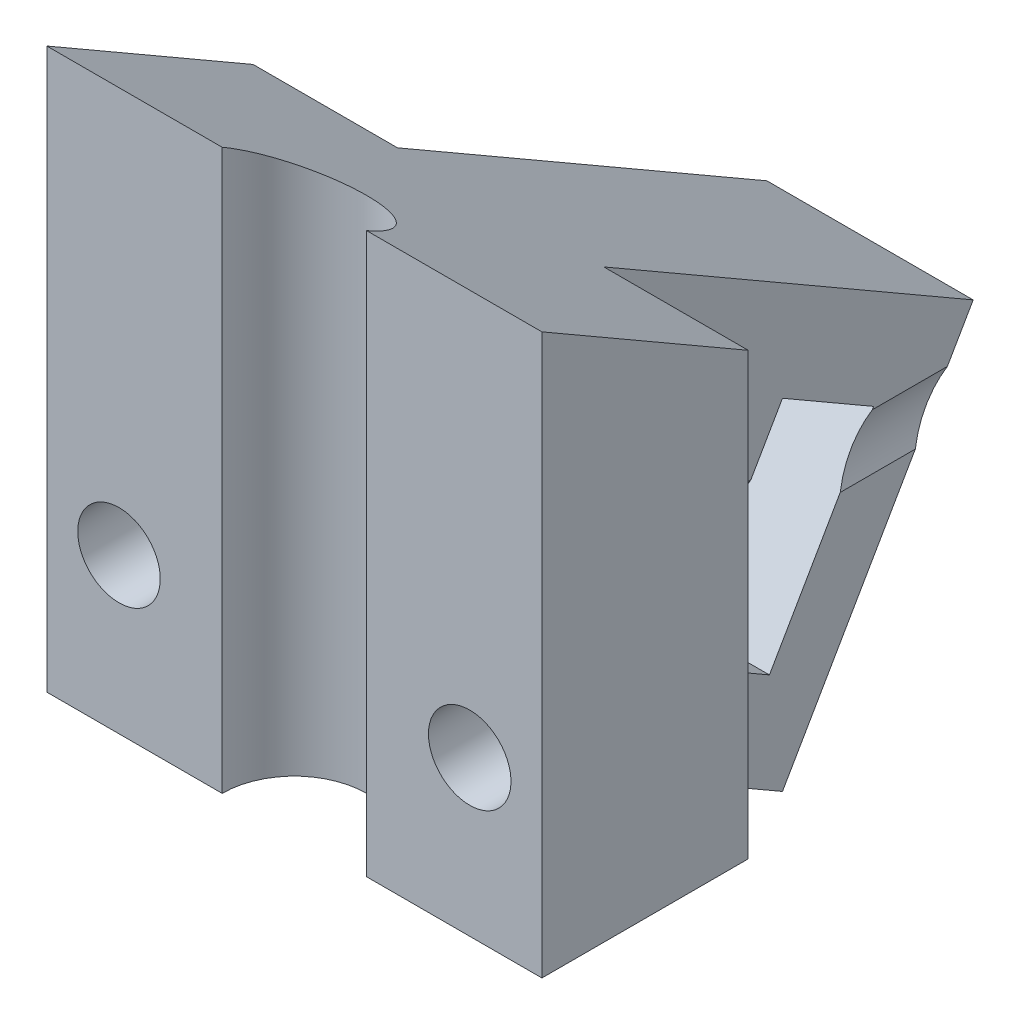
ISO-10303-21;
HEADER;
FILE_DESCRIPTION(('STEP AP214'),'2;1');
FILE_NAME('part.step','',(''),(''),'','','');
FILE_SCHEMA(('AUTOMOTIVE_DESIGN { 1 0 10303 214 1 1 1 1 }'));
ENDSEC;
DATA;
#1=APPLICATION_CONTEXT('core data for automotive mechanical design processes');
#2=APPLICATION_PROTOCOL_DEFINITION('international standard','automotive_design',2000,#1);
#3=PRODUCT_CONTEXT('',#1,'mechanical');
#4=PRODUCT('Part','Part','',(#3));
#5=PRODUCT_RELATED_PRODUCT_CATEGORY('part','',(#4));
#6=PRODUCT_DEFINITION_FORMATION('','',#4);
#7=PRODUCT_DEFINITION_CONTEXT('part definition',#1,'design');
#8=PRODUCT_DEFINITION('design','',#6,#7);
#9=PRODUCT_DEFINITION_SHAPE('','',#8);
#10=(LENGTH_UNIT() NAMED_UNIT(*) SI_UNIT(.MILLI.,.METRE.));
#11=(NAMED_UNIT(*) PLANE_ANGLE_UNIT() SI_UNIT($,.RADIAN.));
#12=(NAMED_UNIT(*) SI_UNIT($,.STERADIAN.) SOLID_ANGLE_UNIT());
#13=UNCERTAINTY_MEASURE_WITH_UNIT(LENGTH_MEASURE(1.E-05),#10,'distance_accuracy_value','');
#14=(GEOMETRIC_REPRESENTATION_CONTEXT(3) GLOBAL_UNCERTAINTY_ASSIGNED_CONTEXT((#13)) GLOBAL_UNIT_ASSIGNED_CONTEXT((#10,
#11,#12)) REPRESENTATION_CONTEXT('',''));
#15=CARTESIAN_POINT('',(0.,0.,0.));
#16=DIRECTION('',(0.,0.,1.));
#17=DIRECTION('',(1.,0.,0.));
#18=AXIS2_PLACEMENT_3D('',#15,#16,#17);
#19=CARTESIAN_POINT('',(-10.,0.,0.));
#20=DIRECTION('',(1.,0.,0.));
#21=DIRECTION('',(0.,0.,-1.));
#22=AXIS2_PLACEMENT_3D('',#19,#20,#21);
#23=PLANE('',#22);
#24=DIRECTION('',(0.,1.,0.));
#25=VECTOR('',#24,1.);
#26=CARTESIAN_POINT('',(-10.,0.,-10.));
#27=LINE('',#26,#25);
#28=CARTESIAN_POINT('',(-10.,17.6925824035673,-10.));
#29=VERTEX_POINT('',#28);
#30=CARTESIAN_POINT('',(-10.,42.7017059221719,-10.));
#31=VERTEX_POINT('',#30);
#32=EDGE_CURVE('E378',#29,#31,#27,.T.);
#33=ORIENTED_EDGE('',*,*,#32,.T.);
#34=DIRECTION('',(0.,-0.499999999999989,-0.866025403784445));
#35=VECTOR('',#34,1.);
#36=CARTESIAN_POINT('',(-10.,30.,-32.));
#37=LINE('',#36,#35);
#38=CARTESIAN_POINT('',(-10.,22.0262794416292,-45.810889132455));
#39=VERTEX_POINT('',#38);
#40=EDGE_CURVE('E382',#31,#39,#37,.T.);
#41=ORIENTED_EDGE('',*,*,#40,.T.);
#42=DIRECTION('',(0.,-0.866025403784445,0.499999999999989));
#43=VECTOR('',#42,1.);
#44=CARTESIAN_POINT('',(-10.,22.0262794416292,-45.810889132455));
#45=LINE('',#44,#43);
#46=CARTESIAN_POINT('',(-10.,17.6925824035673,-43.3088279809437));
#47=VERTEX_POINT('',#46);
#48=EDGE_CURVE('E385',#39,#47,#45,.T.);
#49=ORIENTED_EDGE('',*,*,#48,.T.);
#50=DIRECTION('',(0.,0.,1.));
#51=VECTOR('',#50,1.);
#52=CARTESIAN_POINT('',(-10.,17.6925824035673,-45.810889132455));
#53=LINE('',#52,#51);
#54=CARTESIAN_POINT('',(-10.,17.6925824035673,-36.0283340827204));
#55=VERTEX_POINT('',#54);
#56=EDGE_CURVE('E493',#55,#47,#53,.F.);
#57=ORIENTED_EDGE('',*,*,#56,.F.);
#58=DIRECTION('',(0.,-0.866025403784439,0.5));
#59=VECTOR('',#58,1.);
#60=CARTESIAN_POINT('',(-10.,0.418829476571087,-26.055328180404));
#61=LINE('',#60,#59);
#62=CARTESIAN_POINT('',(-10.,17.9125426330167,-36.155328180404));
#63=VERTEX_POINT('',#62);
#64=EDGE_CURVE('E348',#63,#55,#61,.T.);
#65=ORIENTED_EDGE('',*,*,#64,.F.);
#66=DIRECTION('',(0.,-0.5,-0.866025403784439));
#67=VECTOR('',#66,1.);
#68=CARTESIAN_POINT('',(-10.,23.0125426330167,-27.3218690618028));
#69=LINE('',#68,#67);
#70=CARTESIAN_POINT('',(-10.,23.0125426330167,-27.3218690618028));
#71=VERTEX_POINT('',#70);
#72=EDGE_CURVE('E344',#71,#63,#69,.T.);
#73=ORIENTED_EDGE('',*,*,#72,.F.);
#74=DIRECTION('',(0.,0.866025403784439,-0.5));
#75=VECTOR('',#74,1.);
#76=CARTESIAN_POINT('',(-10.,5.51882947657109,-17.2218690618028));
#77=LINE('',#76,#75);
#78=CARTESIAN_POINT('',(-10.,17.6925824035673,-24.250388591252));
#79=VERTEX_POINT('',#78);
#80=EDGE_CURVE('E340',#79,#71,#77,.T.);
#81=ORIENTED_EDGE('',*,*,#80,.F.);
#82=EDGE_CURVE('E61',#29,#79,#53,.F.);
#83=ORIENTED_EDGE('',*,*,#82,.F.);
#84=EDGE_LOOP('',(#33,#41,#49,#57,#65,#73,#81,#83));
#85=FACE_BOUND('',#84,.T.);
#86=ADVANCED_FACE('F37',(#85),#23,.F.);
#87=CARTESIAN_POINT('',(10.,0.,0.));
#88=DIRECTION('',(1.,0.,0.));
#89=DIRECTION('',(0.,0.,-1.));
#90=AXIS2_PLACEMENT_3D('',#87,#88,#89);
#91=PLANE('',#90);
#92=DIRECTION('',(0.,0.499999999999989,0.866025403784445));
#93=VECTOR('',#92,1.);
#94=CARTESIAN_POINT('',(10.,30.,-32.));
#95=LINE('',#94,#93);
#96=CARTESIAN_POINT('',(10.,22.0262794416292,-45.810889132455));
#97=VERTEX_POINT('',#96);
#98=CARTESIAN_POINT('',(10.,42.7017059221719,-10.));
#99=VERTEX_POINT('',#98);
#100=EDGE_CURVE('E228',#97,#99,#95,.T.);
#101=ORIENTED_EDGE('',*,*,#100,.T.);
#102=DIRECTION('',(0.,-1.,0.));
#103=VECTOR('',#102,1.);
#104=CARTESIAN_POINT('',(10.,0.,-10.));
#105=LINE('',#104,#103);
#106=CARTESIAN_POINT('',(10.,17.6925824035672,-10.));
#107=VERTEX_POINT('',#106);
#108=EDGE_CURVE('E233',#99,#107,#105,.T.);
#109=ORIENTED_EDGE('',*,*,#108,.T.);
#110=DIRECTION('',(0.,0.,1.));
#111=VECTOR('',#110,1.);
#112=CARTESIAN_POINT('',(10.,17.6925824035672,-45.810889132455));
#113=LINE('',#112,#111);
#114=CARTESIAN_POINT('',(10.,17.6925824035672,-24.250388591252));
#115=VERTEX_POINT('',#114);
#116=EDGE_CURVE('E413',#107,#115,#113,.F.);
#117=ORIENTED_EDGE('',*,*,#116,.T.);
#118=DIRECTION('',(0.,-0.866025403784439,0.5));
#119=VECTOR('',#118,1.);
#120=CARTESIAN_POINT('',(10.,-6.07758068494246,-10.5266785334196));
#121=LINE('',#120,#119);
#122=CARTESIAN_POINT('',(10.,23.0125426330167,-27.3218690618028));
#123=VERTEX_POINT('',#122);
#124=EDGE_CURVE('E363',#123,#115,#121,.T.);
#125=ORIENTED_EDGE('',*,*,#124,.F.);
#126=DIRECTION('',(0.,0.5,0.866025403784439));
#127=VECTOR('',#126,1.);
#128=CARTESIAN_POINT('',(10.,29.0901233179592,-16.7951905283831));
#129=LINE('',#128,#127);
#130=CARTESIAN_POINT('',(10.,17.9125426330167,-36.155328180404));
#131=VERTEX_POINT('',#130);
#132=EDGE_CURVE('E366',#131,#123,#129,.T.);
#133=ORIENTED_EDGE('',*,*,#132,.F.);
#134=DIRECTION('',(0.,0.866025403784439,-0.5));
#135=VECTOR('',#134,1.);
#136=CARTESIAN_POINT('',(10.,-11.1775806849425,-19.3601376520209));
#137=LINE('',#136,#135);
#138=CARTESIAN_POINT('',(10.,17.6925824035672,-36.0283340827204));
#139=VERTEX_POINT('',#138);
#140=EDGE_CURVE('E369',#139,#131,#137,.T.);
#141=ORIENTED_EDGE('',*,*,#140,.F.);
#142=CARTESIAN_POINT('',(10.,17.6925824035672,-43.3088279809437));
#143=VERTEX_POINT('',#142);
#144=EDGE_CURVE('E408',#139,#143,#113,.F.);
#145=ORIENTED_EDGE('',*,*,#144,.T.);
#146=DIRECTION('',(0.,0.866025403784445,-0.499999999999989));
#147=VECTOR('',#146,1.);
#148=CARTESIAN_POINT('',(10.,22.0262794416292,-45.810889132455));
#149=LINE('',#148,#147);
#150=EDGE_CURVE('E237',#143,#97,#149,.T.);
#151=ORIENTED_EDGE('',*,*,#150,.T.);
#152=EDGE_LOOP('',(#101,#109,#117,#125,#133,#141,#145,#151));
#153=FACE_BOUND('',#152,.T.);
#154=ADVANCED_FACE('F230',(#153),#91,.T.);
#155=CARTESIAN_POINT('',(-24.,30.,10.));
#156=DIRECTION('',(0.,0.,-1.));
#157=DIRECTION('',(-1.,0.,0.));
#158=AXIS2_PLACEMENT_3D('',#155,#156,#157);
#159=PLANE('',#158);
#160=CARTESIAN_POINT('',(17.,15.,10.));
#161=DIRECTION('',(0.,0.,-1.));
#162=DIRECTION('',(-1.,0.,0.));
#163=AXIS2_PLACEMENT_3D('',#160,#161,#162);
#164=CIRCLE('',#163,4.);
#165=CARTESIAN_POINT('',(13.,15.,10.));
#166=VERTEX_POINT('',#165);
#167=EDGE_CURVE('E302',#166,#166,#164,.T.);
#168=ORIENTED_EDGE('',*,*,#167,.T.);
#169=EDGE_LOOP('',(#168));
#170=FACE_BOUND('',#169,.T.);
#171=DIRECTION('',(1.,0.,0.));
#172=VECTOR('',#171,1.);
#173=CARTESIAN_POINT('',(-24.,54.2487113059644,10.));
#174=LINE('',#173,#172);
#175=CARTESIAN_POINT('',(7.,54.2487113059644,10.));
#176=VERTEX_POINT('',#175);
#177=CARTESIAN_POINT('',(24.,54.2487113059644,10.));
#178=VERTEX_POINT('',#177);
#179=EDGE_CURVE('E577',#176,#178,#174,.T.);
#180=ORIENTED_EDGE('',*,*,#179,.F.);
#181=DIRECTION('',(0.,1.,0.));
#182=VECTOR('',#181,1.);
#183=CARTESIAN_POINT('',(7.,0.,10.));
#184=LINE('',#183,#182);
#185=CARTESIAN_POINT('',(7.,0.,10.));
#186=VERTEX_POINT('',#185);
#187=EDGE_CURVE('E269',#186,#176,#184,.T.);
#188=ORIENTED_EDGE('',*,*,#187,.F.);
#189=DIRECTION('',(1.,0.,0.));
#190=VECTOR('',#189,1.);
#191=CARTESIAN_POINT('',(-24.,0.,10.));
#192=LINE('',#191,#190);
#193=CARTESIAN_POINT('',(24.,0.,10.));
#194=VERTEX_POINT('',#193);
#195=EDGE_CURVE('E282',#186,#194,#192,.T.);
#196=ORIENTED_EDGE('',*,*,#195,.T.);
#197=DIRECTION('',(0.,-1.,0.));
#198=VECTOR('',#197,1.);
#199=CARTESIAN_POINT('',(24.,30.,10.));
#200=LINE('',#199,#198);
#201=EDGE_CURVE('E286',#178,#194,#200,.T.);
#202=ORIENTED_EDGE('',*,*,#201,.F.);
#203=EDGE_LOOP('',(#180,#188,#196,#202));
#204=FACE_BOUND('',#203,.T.);
#205=ADVANCED_FACE('F477',(#170,#204),#159,.F.);
#206=CARTESIAN_POINT('',(24.,30.,10.));
#207=DIRECTION('',(-1.,0.,0.));
#208=DIRECTION('',(0.,0.,1.));
#209=AXIS2_PLACEMENT_3D('',#206,#207,#208);
#210=PLANE('',#209);
#211=DIRECTION('',(0.,-0.499999999999998,-0.86602540378444));
#212=VECTOR('',#211,1.);
#213=CARTESIAN_POINT('',(24.,48.1865334794733,-0.500000000000011));
#214=LINE('',#213,#212);
#215=CARTESIAN_POINT('',(24.,42.7017059221719,-10.));
#216=VERTEX_POINT('',#215);
#217=EDGE_CURVE('E248',#178,#216,#214,.T.);
#218=ORIENTED_EDGE('',*,*,#217,.F.);
#219=ORIENTED_EDGE('',*,*,#201,.T.);
#220=DIRECTION('',(0.,0.,-1.));
#221=VECTOR('',#220,1.);
#222=CARTESIAN_POINT('',(24.,0.,10.));
#223=LINE('',#222,#221);
#224=CARTESIAN_POINT('',(24.,0.,-10.));
#225=VERTEX_POINT('',#224);
#226=EDGE_CURVE('E272',#194,#225,#223,.T.);
#227=ORIENTED_EDGE('',*,*,#226,.T.);
#228=DIRECTION('',(0.,-1.,0.));
#229=VECTOR('',#228,1.);
#230=CARTESIAN_POINT('',(24.,0.,-10.));
#231=LINE('',#230,#229);
#232=EDGE_CURVE('E262',#216,#225,#231,.T.);
#233=ORIENTED_EDGE('',*,*,#232,.F.);
#234=EDGE_LOOP('',(#218,#219,#227,#233));
#235=FACE_BOUND('',#234,.T.);
#236=ADVANCED_FACE('F565',(#235),#210,.F.);
#237=CARTESIAN_POINT('',(-24.,30.,10.));
#238=DIRECTION('',(1.,0.,0.));
#239=DIRECTION('',(0.,0.,-1.));
#240=AXIS2_PLACEMENT_3D('',#237,#238,#239);
#241=PLANE('',#240);
#242=DIRECTION('',(0.,0.499999999999998,0.86602540378444));
#243=VECTOR('',#242,1.);
#244=CARTESIAN_POINT('',(-24.,48.1865334794733,-0.500000000000011));
#245=LINE('',#244,#243);
#246=CARTESIAN_POINT('',(-24.,42.7017059221719,-10.));
#247=VERTEX_POINT('',#246);
#248=CARTESIAN_POINT('',(-24.,54.2487113059644,10.));
#249=VERTEX_POINT('',#248);
#250=EDGE_CURVE('E511',#247,#249,#245,.T.);
#251=ORIENTED_EDGE('',*,*,#250,.F.);
#252=DIRECTION('',(0.,1.,0.));
#253=VECTOR('',#252,1.);
#254=CARTESIAN_POINT('',(-24.,0.,-10.));
#255=LINE('',#254,#253);
#256=CARTESIAN_POINT('',(-24.,0.,-10.));
#257=VERTEX_POINT('',#256);
#258=EDGE_CURVE('E375',#257,#247,#255,.T.);
#259=ORIENTED_EDGE('',*,*,#258,.F.);
#260=DIRECTION('',(0.,0.,1.));
#261=VECTOR('',#260,1.);
#262=CARTESIAN_POINT('',(-24.,0.,10.));
#263=LINE('',#262,#261);
#264=CARTESIAN_POINT('',(-24.,0.,10.));
#265=VERTEX_POINT('',#264);
#266=EDGE_CURVE('E279',#257,#265,#263,.T.);
#267=ORIENTED_EDGE('',*,*,#266,.T.);
#268=DIRECTION('',(0.,-1.,0.));
#269=VECTOR('',#268,1.);
#270=CARTESIAN_POINT('',(-24.,30.,10.));
#271=LINE('',#270,#269);
#272=EDGE_CURVE('E288',#249,#265,#271,.T.);
#273=ORIENTED_EDGE('',*,*,#272,.F.);
#274=EDGE_LOOP('',(#251,#259,#267,#273));
#275=FACE_BOUND('',#274,.T.);
#276=ADVANCED_FACE('F568',(#275),#241,.F.);
#277=CARTESIAN_POINT('',(-17.,15.,10.));
#278=DIRECTION('',(0.,0.,-1.));
#279=DIRECTION('',(-1.,0.,0.));
#280=AXIS2_PLACEMENT_3D('',#277,#278,#279);
#281=CIRCLE('',#280,4.);
#282=CARTESIAN_POINT('',(-21.,15.,10.));
#283=VERTEX_POINT('',#282);
#284=EDGE_CURVE('E333',#283,#283,#281,.T.);
#285=ORIENTED_EDGE('',*,*,#284,.T.);
#286=EDGE_LOOP('',(#285));
#287=FACE_BOUND('',#286,.T.);
#288=DIRECTION('',(1.,0.,0.));
#289=VECTOR('',#288,1.);
#290=CARTESIAN_POINT('',(-24.,54.2487113059644,10.));
#291=LINE('',#290,#289);
#292=CARTESIAN_POINT('',(-7.,54.2487113059644,10.));
#293=VERTEX_POINT('',#292);
#294=EDGE_CURVE('E514',#249,#293,#291,.T.);
#295=ORIENTED_EDGE('',*,*,#294,.F.);
#296=ORIENTED_EDGE('',*,*,#272,.T.);
#297=CARTESIAN_POINT('',(-7.,0.,10.));
#298=VERTEX_POINT('',#297);
#299=EDGE_CURVE('E283',#265,#298,#192,.T.);
#300=ORIENTED_EDGE('',*,*,#299,.T.);
#301=DIRECTION('',(0.,-1.,0.));
#302=VECTOR('',#301,1.);
#303=CARTESIAN_POINT('',(-7.,30.,10.));
#304=LINE('',#303,#302);
#305=EDGE_CURVE('E266',#293,#298,#304,.T.);
#306=ORIENTED_EDGE('',*,*,#305,.F.);
#307=EDGE_LOOP('',(#295,#296,#300,#306));
#308=FACE_BOUND('',#307,.T.);
#309=ADVANCED_FACE('F567',(#287,#308),#159,.F.);
#310=CARTESIAN_POINT('',(10.,0.,-10.));
#311=DIRECTION('',(0.,0.,1.));
#312=DIRECTION('',(1.,0.,0.));
#313=AXIS2_PLACEMENT_3D('',#310,#311,#312);
#314=PLANE('',#313);
#315=CARTESIAN_POINT('',(17.,15.,-10.));
#316=DIRECTION('',(0.,0.,-1.));
#317=DIRECTION('',(-1.,0.,0.));
#318=AXIS2_PLACEMENT_3D('',#315,#316,#317);
#319=CIRCLE('',#318,4.);
#320=CARTESIAN_POINT('',(13.,15.,-10.));
#321=VERTEX_POINT('',#320);
#322=EDGE_CURVE('E296',#321,#321,#319,.T.);
#323=ORIENTED_EDGE('',*,*,#322,.F.);
#324=EDGE_LOOP('',(#323));
#325=FACE_BOUND('',#324,.T.);
#326=DIRECTION('',(-1.,0.,0.));
#327=VECTOR('',#326,1.);
#328=CARTESIAN_POINT('',(10.,42.7017059221719,-10.));
#329=LINE('',#328,#327);
#330=EDGE_CURVE('E245',#216,#99,#329,.T.);
#331=ORIENTED_EDGE('',*,*,#330,.F.);
#332=ORIENTED_EDGE('',*,*,#232,.T.);
#333=DIRECTION('',(-1.,0.,0.));
#334=VECTOR('',#333,1.);
#335=CARTESIAN_POINT('',(-24.,0.,-10.));
#336=LINE('',#335,#334);
#337=CARTESIAN_POINT('',(10.,0.,-10.));
#338=VERTEX_POINT('',#337);
#339=EDGE_CURVE('E276',#225,#338,#336,.T.);
#340=ORIENTED_EDGE('',*,*,#339,.T.);
#341=CARTESIAN_POINT('',(10.,12.3074175964328,-10.));
#342=VERTEX_POINT('',#341);
#343=EDGE_CURVE('E241',#342,#338,#105,.T.);
#344=ORIENTED_EDGE('',*,*,#343,.F.);
#345=CARTESIAN_POINT('',(17.,15.,-10.));
#346=DIRECTION('',(0.,0.,-1.));
#347=DIRECTION('',(-1.,0.,0.));
#348=AXIS2_PLACEMENT_3D('',#345,#346,#347);
#349=CIRCLE('',#348,7.5);
#350=EDGE_CURVE('E255',#342,#107,#349,.T.);
#351=ORIENTED_EDGE('',*,*,#350,.T.);
#352=ORIENTED_EDGE('',*,*,#108,.F.);
#353=EDGE_LOOP('',(#331,#332,#340,#344,#351,#352));
#354=FACE_BOUND('',#353,.T.);
#355=ADVANCED_FACE('F253',(#325,#354),#314,.F.);
#356=CARTESIAN_POINT('',(-10.,0.,-10.));
#357=DIRECTION('',(0.,0.,1.));
#358=DIRECTION('',(1.,0.,0.));
#359=AXIS2_PLACEMENT_3D('',#356,#357,#358);
#360=PLANE('',#359);
#361=CARTESIAN_POINT('',(-17.,15.,-10.));
#362=DIRECTION('',(0.,0.,-1.));
#363=DIRECTION('',(-1.,0.,0.));
#364=AXIS2_PLACEMENT_3D('',#361,#362,#363);
#365=CIRCLE('',#364,4.);
#366=CARTESIAN_POINT('',(-21.,15.,-10.));
#367=VERTEX_POINT('',#366);
#368=EDGE_CURVE('E331',#367,#367,#365,.T.);
#369=ORIENTED_EDGE('',*,*,#368,.F.);
#370=EDGE_LOOP('',(#369));
#371=FACE_BOUND('',#370,.T.);
#372=DIRECTION('',(-1.,0.,0.));
#373=VECTOR('',#372,1.);
#374=CARTESIAN_POINT('',(-10.,42.7017059221719,-10.));
#375=LINE('',#374,#373);
#376=EDGE_CURVE('E505',#31,#247,#375,.T.);
#377=ORIENTED_EDGE('',*,*,#376,.F.);
#378=ORIENTED_EDGE('',*,*,#32,.F.);
#379=CARTESIAN_POINT('',(-17.,15.,-10.));
#380=DIRECTION('',(0.,0.,-1.));
#381=DIRECTION('',(-1.,0.,0.));
#382=AXIS2_PLACEMENT_3D('',#379,#380,#381);
#383=CIRCLE('',#382,7.5);
#384=CARTESIAN_POINT('',(-10.,12.3074175964327,-10.));
#385=VERTEX_POINT('',#384);
#386=EDGE_CURVE('E510',#29,#385,#383,.T.);
#387=ORIENTED_EDGE('',*,*,#386,.T.);
#388=CARTESIAN_POINT('',(-10.,0.,-10.));
#389=VERTEX_POINT('',#388);
#390=EDGE_CURVE('E379',#389,#385,#27,.T.);
#391=ORIENTED_EDGE('',*,*,#390,.F.);
#392=DIRECTION('',(-1.,0.,0.));
#393=VECTOR('',#392,1.);
#394=CARTESIAN_POINT('',(-10.,0.,-10.));
#395=LINE('',#394,#393);
#396=EDGE_CURVE('E265',#389,#257,#395,.T.);
#397=ORIENTED_EDGE('',*,*,#396,.T.);
#398=ORIENTED_EDGE('',*,*,#258,.T.);
#399=EDGE_LOOP('',(#377,#378,#387,#391,#397,#398));
#400=FACE_BOUND('',#399,.T.);
#401=ADVANCED_FACE('F489',(#371,#400),#360,.F.);
#402=CARTESIAN_POINT('',(0.,0.,10.));
#403=DIRECTION('',(0.,1.,0.));
#404=DIRECTION('',(0.,0.,1.));
#405=AXIS2_PLACEMENT_3D('',#402,#403,#404);
#406=CYLINDRICAL_SURFACE('',#405,7.);
#407=CARTESIAN_POINT('',(0.,54.2487113059644,10.));
#408=DIRECTION('',(0.,0.86602540378444,-0.499999999999998));
#409=DIRECTION('',(0.,0.499999999999998,0.86602540378444));
#410=AXIS2_PLACEMENT_3D('',#407,#408,#409);
#411=ELLIPSE('',#410,8.08290376865475,7.);
#412=EDGE_CURVE('E858',#293,#176,#411,.F.);
#413=ORIENTED_EDGE('',*,*,#412,.F.);
#414=ORIENTED_EDGE('',*,*,#305,.T.);
#415=CARTESIAN_POINT('',(0.,0.,10.));
#416=DIRECTION('',(0.,-1.,0.));
#417=DIRECTION('',(0.,0.,-1.));
#418=AXIS2_PLACEMENT_3D('',#415,#416,#417);
#419=CIRCLE('',#418,7.);
#420=CARTESIAN_POINT('',(0.,0.,3.));
#421=VERTEX_POINT('',#420);
#422=EDGE_CURVE('E290',#421,#298,#419,.F.);
#423=ORIENTED_EDGE('',*,*,#422,.F.);
#424=DIRECTION('',(0.,1.,0.));
#425=VECTOR('',#424,1.);
#426=CARTESIAN_POINT('',(0.,0.,3.));
#427=LINE('',#426,#425);
#428=CARTESIAN_POINT('',(0.,30.,3.));
#429=VERTEX_POINT('',#428);
#430=EDGE_CURVE('E295',#421,#429,#427,.T.);
#431=ORIENTED_EDGE('',*,*,#430,.T.);
#432=ORIENTED_EDGE('',*,*,#430,.F.);
#433=CARTESIAN_POINT('',(0.,0.,10.));
#434=DIRECTION('',(0.,-1.,0.));
#435=DIRECTION('',(0.,0.,-1.));
#436=AXIS2_PLACEMENT_3D('',#433,#434,#435);
#437=CIRCLE('',#436,7.);
#438=EDGE_CURVE('E293',#186,#421,#437,.F.);
#439=ORIENTED_EDGE('',*,*,#438,.F.);
#440=ORIENTED_EDGE('',*,*,#187,.T.);
#441=EDGE_LOOP('',(#413,#414,#423,#431,#432,#439,#440));
#442=FACE_BOUND('',#441,.T.);
#443=ADVANCED_FACE('F39',(#442),#406,.F.);
#444=DIRECTION('',(0.,0.,1.));
#445=VECTOR('',#444,1.);
#446=CARTESIAN_POINT('',(-10.,12.3074175964327,-45.810889132455));
#447=LINE('',#446,#445);
#448=CARTESIAN_POINT('',(-10.,12.3074175964327,-40.1997016299142));
#449=VERTEX_POINT('',#448);
#450=CARTESIAN_POINT('',(-10.,12.3074175964327,-32.9192077316907));
#451=VERTEX_POINT('',#450);
#452=EDGE_CURVE('E54',#449,#451,#447,.T.);
#453=ORIENTED_EDGE('',*,*,#452,.F.);
#454=CARTESIAN_POINT('',(-10.,-9.99999999999977,-27.3205080756889));
#455=VERTEX_POINT('',#454);
#456=EDGE_CURVE('E384',#449,#455,#45,.T.);
#457=ORIENTED_EDGE('',*,*,#456,.T.);
#458=DIRECTION('',(0.,0.499999999999989,0.866025403784445));
#459=VECTOR('',#458,1.);
#460=CARTESIAN_POINT('',(-10.,-9.99999999999977,-27.3205080756889));
#461=LINE('',#460,#459);
#462=EDGE_CURVE('E376',#455,#389,#461,.T.);
#463=ORIENTED_EDGE('',*,*,#462,.T.);
#464=ORIENTED_EDGE('',*,*,#390,.T.);
#465=CARTESIAN_POINT('',(-10.,12.3074175964327,-21.1412622402224));
#466=VERTEX_POINT('',#465);
#467=EDGE_CURVE('E496',#466,#385,#447,.T.);
#468=ORIENTED_EDGE('',*,*,#467,.F.);
#469=CARTESIAN_POINT('',(-10.,5.51882947657109,-17.2218690618028));
#470=VERTEX_POINT('',#469);
#471=EDGE_CURVE('E341',#470,#466,#77,.T.);
#472=ORIENTED_EDGE('',*,*,#471,.F.);
#473=DIRECTION('',(0.,0.5,0.866025403784439));
#474=VECTOR('',#473,1.);
#475=CARTESIAN_POINT('',(-10.,5.51882947657109,-17.2218690618028));
#476=LINE('',#475,#474);
#477=CARTESIAN_POINT('',(-10.,0.418829476571087,-26.055328180404));
#478=VERTEX_POINT('',#477);
#479=EDGE_CURVE('E336',#478,#470,#476,.T.);
#480=ORIENTED_EDGE('',*,*,#479,.F.);
#481=EDGE_CURVE('E347',#451,#478,#61,.T.);
#482=ORIENTED_EDGE('',*,*,#481,.F.);
#483=EDGE_LOOP('',(#453,#457,#463,#464,#468,#472,#480,#482));
#484=FACE_BOUND('',#483,.T.);
#485=ADVANCED_FACE('F473',(#484),#23,.F.);
#486=CARTESIAN_POINT('',(10.,-9.99999999999977,-27.3205080756889));
#487=VERTEX_POINT('',#486);
#488=CARTESIAN_POINT('',(10.,12.3074175964328,-40.1997016299142));
#489=VERTEX_POINT('',#488);
#490=EDGE_CURVE('E242',#487,#489,#149,.T.);
#491=ORIENTED_EDGE('',*,*,#490,.T.);
#492=DIRECTION('',(0.,0.,1.));
#493=VECTOR('',#492,1.);
#494=CARTESIAN_POINT('',(10.,12.3074175964328,-45.810889132455));
#495=LINE('',#494,#493);
#496=CARTESIAN_POINT('',(10.,12.3074175964328,-32.9192077316908));
#497=VERTEX_POINT('',#496);
#498=EDGE_CURVE('E398',#489,#497,#495,.T.);
#499=ORIENTED_EDGE('',*,*,#498,.T.);
#500=CARTESIAN_POINT('',(10.,0.418829476571087,-26.055328180404));
#501=VERTEX_POINT('',#500);
#502=EDGE_CURVE('E370',#501,#497,#137,.T.);
#503=ORIENTED_EDGE('',*,*,#502,.F.);
#504=DIRECTION('',(0.,-0.5,-0.866025403784439));
#505=VECTOR('',#504,1.);
#506=CARTESIAN_POINT('',(10.,11.5964101615135,-6.69519052838316));
#507=LINE('',#506,#505);
#508=CARTESIAN_POINT('',(10.,5.51882947657109,-17.2218690618028));
#509=VERTEX_POINT('',#508);
#510=EDGE_CURVE('E373',#509,#501,#507,.T.);
#511=ORIENTED_EDGE('',*,*,#510,.F.);
#512=CARTESIAN_POINT('',(10.,12.3074175964328,-21.1412622402224));
#513=VERTEX_POINT('',#512);
#514=EDGE_CURVE('E355',#513,#509,#121,.T.);
#515=ORIENTED_EDGE('',*,*,#514,.F.);
#516=EDGE_CURVE('E521',#513,#342,#495,.T.);
#517=ORIENTED_EDGE('',*,*,#516,.T.);
#518=ORIENTED_EDGE('',*,*,#343,.T.);
#519=DIRECTION('',(0.,-0.499999999999989,-0.866025403784445));
#520=VECTOR('',#519,1.);
#521=CARTESIAN_POINT('',(10.,-9.99999999999977,-27.3205080756889));
#522=LINE('',#521,#520);
#523=EDGE_CURVE('E264',#338,#487,#522,.T.);
#524=ORIENTED_EDGE('',*,*,#523,.T.);
#525=EDGE_LOOP('',(#491,#499,#503,#511,#515,#517,#518,#524));
#526=FACE_BOUND('',#525,.T.);
#527=ADVANCED_FACE('F396',(#526),#91,.T.);
#528=CARTESIAN_POINT('',(-24.,4.33012701892213,-2.49999999999989));
#529=DIRECTION('',(0.,-0.866025403784445,0.499999999999989));
#530=DIRECTION('',(0.,-0.499999999999989,-0.866025403784445));
#531=AXIS2_PLACEMENT_3D('',#528,#529,#530);
#532=PLANE('',#531);
#533=ORIENTED_EDGE('',*,*,#462,.F.);
#534=DIRECTION('',(1.,0.,0.));
#535=VECTOR('',#534,1.);
#536=CARTESIAN_POINT('',(-24.,-9.99999999999977,-27.3205080756889));
#537=LINE('',#536,#535);
#538=EDGE_CURVE('E256',#455,#487,#537,.T.);
#539=ORIENTED_EDGE('',*,*,#538,.T.);
#540=ORIENTED_EDGE('',*,*,#523,.F.);
#541=EDGE_CURVE('E275',#338,#389,#336,.T.);
#542=ORIENTED_EDGE('',*,*,#541,.T.);
#543=EDGE_LOOP('',(#533,#539,#540,#542));
#544=FACE_BOUND('',#543,.T.);
#545=ADVANCED_FACE('F488',(#544),#532,.T.);
#546=CARTESIAN_POINT('',(-24.,36.3564064605511,-20.990381056766));
#547=DIRECTION('',(0.,-0.866025403784445,0.499999999999989));
#548=DIRECTION('',(0.,-0.499999999999989,-0.866025403784445));
#549=AXIS2_PLACEMENT_3D('',#546,#547,#548);
#550=PLANE('',#549);
#551=DIRECTION('',(1.,0.,0.));
#552=VECTOR('',#551,1.);
#553=CARTESIAN_POINT('',(-24.,22.0262794416292,-45.810889132455));
#554=LINE('',#553,#552);
#555=EDGE_CURVE('E258',#39,#97,#554,.T.);
#556=ORIENTED_EDGE('',*,*,#555,.F.);
#557=ORIENTED_EDGE('',*,*,#40,.F.);
#558=ORIENTED_EDGE('',*,*,#376,.T.);
#559=ORIENTED_EDGE('',*,*,#250,.T.);
#560=ORIENTED_EDGE('',*,*,#294,.T.);
#561=ORIENTED_EDGE('',*,*,#412,.T.);
#562=ORIENTED_EDGE('',*,*,#179,.T.);
#563=ORIENTED_EDGE('',*,*,#217,.T.);
#564=ORIENTED_EDGE('',*,*,#330,.T.);
#565=ORIENTED_EDGE('',*,*,#100,.F.);
#566=EDGE_LOOP('',(#556,#557,#558,#559,#560,#561,#562,#563,#564,#565));
#567=FACE_BOUND('',#566,.T.);
#568=ADVANCED_FACE('F246',(#567),#550,.F.);
#569=CARTESIAN_POINT('',(-24.,-14.3301270189219,-24.820508075689));
#570=DIRECTION('',(0.,-0.499999999999988,-0.866025403784445));
#571=DIRECTION('',(0.,0.866025403784445,-0.499999999999988));
#572=AXIS2_PLACEMENT_3D('',#569,#570,#571);
#573=PLANE('',#572);
#574=DIRECTION('',(-1.,0.,0.));
#575=VECTOR('',#574,1.);
#576=CARTESIAN_POINT('',(2.76923076923077,6.01313972081475,-36.565698604072));
#577=LINE('',#576,#575);
#578=CARTESIAN_POINT('',(2.76923076923077,6.01313972081474,-36.565698604072));
#579=VERTEX_POINT('',#578);
#580=CARTESIAN_POINT('',(-2.15384615384615,6.01313972081475,-36.565698604072));
#581=VERTEX_POINT('',#580);
#582=EDGE_CURVE('E407',#579,#581,#577,.T.);
#583=ORIENTED_EDGE('',*,*,#582,.T.);
#584=DIRECTION('',(0.,-0.866025403784445,0.499999999999988));
#585=VECTOR('',#584,1.);
#586=CARTESIAN_POINT('',(-2.15384615384615,6.01313972081475,-36.565698604072));
#587=LINE('',#586,#585);
#588=CARTESIAN_POINT('',(-2.15384615384615,-0.91506350946079,-32.5656986040721));
#589=VERTEX_POINT('',#588);
#590=EDGE_CURVE('E410',#581,#589,#587,.T.);
#591=ORIENTED_EDGE('',*,*,#590,.T.);
#592=DIRECTION('',(1.,0.,0.));
#593=VECTOR('',#592,1.);
#594=CARTESIAN_POINT('',(-2.15384615384615,-0.91506350946082,-32.5656986040721));
#595=LINE('',#594,#593);
#596=CARTESIAN_POINT('',(-1.02564102564102,-0.915063509460811,-32.5656986040721));
#597=VERTEX_POINT('',#596);
#598=EDGE_CURVE('E434',#589,#597,#595,.T.);
#599=ORIENTED_EDGE('',*,*,#598,.T.);
#600=DIRECTION('',(0.,0.866025403784445,-0.499999999999988));
#601=VECTOR('',#600,1.);
#602=CARTESIAN_POINT('',(-1.02564102564102,-0.91506350946082,-32.5656986040721));
#603=LINE('',#602,#601);
#604=CARTESIAN_POINT('',(-1.02564102564102,5.21373165578295,-36.1041601425335));
#605=VERTEX_POINT('',#604);
#606=EDGE_CURVE('E436',#597,#605,#603,.T.);
#607=ORIENTED_EDGE('',*,*,#606,.T.);
#608=DIRECTION('',(1.,0.,0.));
#609=VECTOR('',#608,1.);
#610=CARTESIAN_POINT('',(-1.02564102564102,5.21373165578295,-36.1041601425335));
#611=LINE('',#610,#609);
#612=CARTESIAN_POINT('',(2.76923076923077,5.21373165578296,-36.1041601425335));
#613=VERTEX_POINT('',#612);
#614=EDGE_CURVE('E437',#605,#613,#611,.T.);
#615=ORIENTED_EDGE('',*,*,#614,.T.);
#616=DIRECTION('',(0.,0.866025403784446,-0.499999999999988));
#617=VECTOR('',#616,1.);
#618=CARTESIAN_POINT('',(2.76923076923077,5.21373165578295,-36.1041601425335));
#619=LINE('',#618,#617);
#620=EDGE_CURVE('E315',#613,#579,#619,.T.);
#621=ORIENTED_EDGE('',*,*,#620,.T.);
#622=EDGE_LOOP('',(#583,#591,#599,#607,#615,#621));
#623=FACE_BOUND('',#622,.T.);
#624=ORIENTED_EDGE('',*,*,#456,.F.);
#625=CARTESIAN_POINT('',(-17.,15.,-41.754264805429));
#626=DIRECTION('',(0.,-0.499999999999988,-0.866025403784445));
#627=DIRECTION('',(0.,-0.866025403784445,0.499999999999988));
#628=AXIS2_PLACEMENT_3D('',#625,#626,#627);
#629=ELLIPSE('',#628,8.66025403784432,7.5);
#630=EDGE_CURVE('E499',#449,#47,#629,.F.);
#631=ORIENTED_EDGE('',*,*,#630,.T.);
#632=ORIENTED_EDGE('',*,*,#48,.F.);
#633=ORIENTED_EDGE('',*,*,#555,.T.);
#634=ORIENTED_EDGE('',*,*,#150,.F.);
#635=CARTESIAN_POINT('',(17.,15.,-41.754264805429));
#636=DIRECTION('',(0.,-0.499999999999988,-0.866025403784445));
#637=DIRECTION('',(0.,-0.866025403784445,0.499999999999988));
#638=AXIS2_PLACEMENT_3D('',#635,#636,#637);
#639=ELLIPSE('',#638,8.66025403784432,7.5);
#640=EDGE_CURVE('E405',#143,#489,#639,.F.);
#641=ORIENTED_EDGE('',*,*,#640,.T.);
#642=ORIENTED_EDGE('',*,*,#490,.F.);
#643=ORIENTED_EDGE('',*,*,#538,.F.);
#644=EDGE_LOOP('',(#624,#631,#632,#633,#634,#641,#642,#643));
#645=FACE_BOUND('',#644,.T.);
#646=ADVANCED_FACE('F404',(#623,#645),#573,.T.);
#647=CARTESIAN_POINT('',(0.,0.,0.));
#648=DIRECTION('',(0.,-1.,0.));
#649=DIRECTION('',(0.,0.,-1.));
#650=AXIS2_PLACEMENT_3D('',#647,#648,#649);
#651=PLANE('',#650);
#652=ORIENTED_EDGE('',*,*,#195,.F.);
#653=ORIENTED_EDGE('',*,*,#438,.T.);
#654=ORIENTED_EDGE('',*,*,#422,.T.);
#655=ORIENTED_EDGE('',*,*,#299,.F.);
#656=ORIENTED_EDGE('',*,*,#266,.F.);
#657=ORIENTED_EDGE('',*,*,#396,.F.);
#658=ORIENTED_EDGE('',*,*,#541,.F.);
#659=ORIENTED_EDGE('',*,*,#339,.F.);
#660=ORIENTED_EDGE('',*,*,#226,.F.);
#661=EDGE_LOOP('',(#652,#653,#654,#655,#656,#657,#658,#659,#660));
#662=FACE_BOUND('',#661,.T.);
#663=ADVANCED_FACE('F548',(#662),#651,.T.);
#664=CARTESIAN_POINT('',(24.,5.51882947657109,-17.2218690618028));
#665=DIRECTION('',(0.,-0.866025403784439,0.5));
#666=DIRECTION('',(0.,-0.5,-0.866025403784439));
#667=AXIS2_PLACEMENT_3D('',#664,#665,#666);
#668=PLANE('',#667);
#669=ORIENTED_EDGE('',*,*,#510,.T.);
#670=DIRECTION('',(-1.,0.,0.));
#671=VECTOR('',#670,1.);
#672=CARTESIAN_POINT('',(24.,0.418829476571087,-26.055328180404));
#673=LINE('',#672,#671);
#674=EDGE_CURVE('E352',#501,#478,#673,.T.);
#675=ORIENTED_EDGE('',*,*,#674,.T.);
#676=ORIENTED_EDGE('',*,*,#479,.T.);
#677=DIRECTION('',(-1.,0.,0.));
#678=VECTOR('',#677,1.);
#679=CARTESIAN_POINT('',(24.,5.51882947657109,-17.2218690618028));
#680=LINE('',#679,#678);
#681=EDGE_CURVE('E351',#509,#470,#680,.T.);
#682=ORIENTED_EDGE('',*,*,#681,.F.);
#683=EDGE_LOOP('',(#669,#675,#676,#682));
#684=FACE_BOUND('',#683,.T.);
#685=ADVANCED_FACE('F562',(#684),#668,.F.);
#686=CARTESIAN_POINT('',(24.,0.418829476571087,-26.055328180404));
#687=DIRECTION('',(0.,-0.5,-0.866025403784439));
#688=DIRECTION('',(0.,0.866025403784439,-0.5));
#689=AXIS2_PLACEMENT_3D('',#686,#687,#688);
#690=PLANE('',#689);
#691=CARTESIAN_POINT('',(-17.,15.,-34.4737709072055));
#692=DIRECTION('',(0.,-0.5,-0.866025403784439));
#693=DIRECTION('',(0.,-0.866025403784439,0.5));
#694=AXIS2_PLACEMENT_3D('',#691,#692,#693);
#695=ELLIPSE('',#694,8.66025403784438,7.5);
#696=EDGE_CURVE('E494',#451,#55,#695,.F.);
#697=ORIENTED_EDGE('',*,*,#696,.F.);
#698=ORIENTED_EDGE('',*,*,#481,.T.);
#699=ORIENTED_EDGE('',*,*,#674,.F.);
#700=ORIENTED_EDGE('',*,*,#502,.T.);
#701=CARTESIAN_POINT('',(17.,15.,-34.4737709072055));
#702=DIRECTION('',(0.,-0.5,-0.866025403784439));
#703=DIRECTION('',(0.,-0.866025403784439,0.5));
#704=AXIS2_PLACEMENT_3D('',#701,#702,#703);
#705=ELLIPSE('',#704,8.66025403784438,7.5);
#706=EDGE_CURVE('E416',#139,#497,#705,.F.);
#707=ORIENTED_EDGE('',*,*,#706,.F.);
#708=ORIENTED_EDGE('',*,*,#140,.T.);
#709=DIRECTION('',(-1.,0.,0.));
#710=VECTOR('',#709,1.);
#711=CARTESIAN_POINT('',(24.,17.9125426330167,-36.155328180404));
#712=LINE('',#711,#710);
#713=EDGE_CURVE('E356',#131,#63,#712,.T.);
#714=ORIENTED_EDGE('',*,*,#713,.T.);
#715=ORIENTED_EDGE('',*,*,#64,.T.);
#716=EDGE_LOOP('',(#697,#698,#699,#700,#707,#708,#714,#715));
#717=FACE_BOUND('',#716,.T.);
#718=ADVANCED_FACE('F528',(#717),#690,.F.);
#719=CARTESIAN_POINT('',(24.,23.0125426330167,-27.3218690618028));
#720=DIRECTION('',(0.,0.866025403784439,-0.5));
#721=DIRECTION('',(0.,0.5,0.866025403784439));
#722=AXIS2_PLACEMENT_3D('',#719,#720,#721);
#723=PLANE('',#722);
#724=ORIENTED_EDGE('',*,*,#132,.T.);
#725=DIRECTION('',(-1.,0.,0.));
#726=VECTOR('',#725,1.);
#727=CARTESIAN_POINT('',(24.,23.0125426330167,-27.3218690618028));
#728=LINE('',#727,#726);
#729=EDGE_CURVE('E358',#123,#71,#728,.T.);
#730=ORIENTED_EDGE('',*,*,#729,.T.);
#731=ORIENTED_EDGE('',*,*,#72,.T.);
#732=ORIENTED_EDGE('',*,*,#713,.F.);
#733=EDGE_LOOP('',(#724,#730,#731,#732));
#734=FACE_BOUND('',#733,.T.);
#735=ADVANCED_FACE('F533',(#734),#723,.F.);
#736=CARTESIAN_POINT('',(24.,5.51882947657109,-17.2218690618028));
#737=DIRECTION('',(0.,0.5,0.866025403784439));
#738=DIRECTION('',(0.,-0.866025403784439,0.5));
#739=AXIS2_PLACEMENT_3D('',#736,#737,#738);
#740=PLANE('',#739);
#741=CARTESIAN_POINT('',(-17.,15.,-22.6958254157372));
#742=DIRECTION('',(0.,0.5,0.866025403784439));
#743=DIRECTION('',(0.,-0.866025403784439,0.5));
#744=AXIS2_PLACEMENT_3D('',#741,#742,#743);
#745=ELLIPSE('',#744,8.66025403784439,7.5);
#746=EDGE_CURVE('E11',#79,#466,#745,.F.);
#747=ORIENTED_EDGE('',*,*,#746,.F.);
#748=ORIENTED_EDGE('',*,*,#80,.T.);
#749=ORIENTED_EDGE('',*,*,#729,.F.);
#750=ORIENTED_EDGE('',*,*,#124,.T.);
#751=CARTESIAN_POINT('',(17.,15.,-22.6958254157372));
#752=DIRECTION('',(0.,0.5,0.866025403784439));
#753=DIRECTION('',(0.,-0.866025403784439,0.5));
#754=AXIS2_PLACEMENT_3D('',#751,#752,#753);
#755=ELLIPSE('',#754,8.66025403784439,7.5);
#756=EDGE_CURVE('E46',#513,#115,#755,.F.);
#757=ORIENTED_EDGE('',*,*,#756,.F.);
#758=ORIENTED_EDGE('',*,*,#514,.T.);
#759=ORIENTED_EDGE('',*,*,#681,.T.);
#760=ORIENTED_EDGE('',*,*,#471,.T.);
#761=EDGE_LOOP('',(#747,#748,#749,#750,#757,#758,#759,#760));
#762=FACE_BOUND('',#761,.T.);
#763=ADVANCED_FACE('F537',(#762),#740,.F.);
#764=CARTESIAN_POINT('',(-17.,15.,10.));
#765=DIRECTION('',(0.,0.,-1.));
#766=DIRECTION('',(-1.,0.,0.));
#767=AXIS2_PLACEMENT_3D('',#764,#765,#766);
#768=CYLINDRICAL_SURFACE('',#767,4.);
#769=ORIENTED_EDGE('',*,*,#284,.F.);
#770=EDGE_LOOP('',(#769));
#771=FACE_BOUND('',#770,.T.);
#772=ORIENTED_EDGE('',*,*,#368,.T.);
#773=EDGE_LOOP('',(#772));
#774=FACE_BOUND('',#773,.T.);
#775=ADVANCED_FACE('F598',(#771,#774),#768,.F.);
#776=CARTESIAN_POINT('',(17.,15.,10.));
#777=DIRECTION('',(0.,0.,-1.));
#778=DIRECTION('',(-1.,0.,0.));
#779=AXIS2_PLACEMENT_3D('',#776,#777,#778);
#780=CYLINDRICAL_SURFACE('',#779,4.);
#781=ORIENTED_EDGE('',*,*,#167,.F.);
#782=EDGE_LOOP('',(#781));
#783=FACE_BOUND('',#782,.T.);
#784=ORIENTED_EDGE('',*,*,#322,.T.);
#785=EDGE_LOOP('',(#784));
#786=FACE_BOUND('',#785,.T.);
#787=ADVANCED_FACE('F603',(#783,#786),#780,.F.);
#788=CARTESIAN_POINT('',(2.76923076923077,5.51313972081476,-37.4317240078564));
#789=DIRECTION('',(0.,0.866025403784445,-0.499999999999989));
#790=DIRECTION('',(0.,0.499999999999989,0.866025403784445));
#791=AXIS2_PLACEMENT_3D('',#788,#789,#790);
#792=PLANE('',#791);
#793=ORIENTED_EDGE('',*,*,#582,.F.);
#794=DIRECTION('',(0.,0.499999999999989,0.866025403784445));
#795=VECTOR('',#794,1.);
#796=CARTESIAN_POINT('',(2.76923076923077,5.51313972081476,-37.4317240078564));
#797=LINE('',#796,#795);
#798=CARTESIAN_POINT('',(2.76923076923077,5.51313972081476,-37.4317240078564));
#799=VERTEX_POINT('',#798);
#800=EDGE_CURVE('E297',#799,#579,#797,.T.);
#801=ORIENTED_EDGE('',*,*,#800,.F.);
#802=DIRECTION('',(-1.,0.,0.));
#803=VECTOR('',#802,1.);
#804=CARTESIAN_POINT('',(2.76923076923077,5.51313972081476,-37.4317240078564));
#805=LINE('',#804,#803);
#806=CARTESIAN_POINT('',(-2.15384615384615,5.51313972081476,-37.4317240078564));
#807=VERTEX_POINT('',#806);
#808=EDGE_CURVE('E417',#799,#807,#805,.T.);
#809=ORIENTED_EDGE('',*,*,#808,.T.);
#810=DIRECTION('',(0.,0.499999999999989,0.866025403784445));
#811=VECTOR('',#810,1.);
#812=CARTESIAN_POINT('',(-2.15384615384615,5.51313972081476,-37.4317240078564));
#813=LINE('',#812,#811);
#814=EDGE_CURVE('E326',#807,#581,#813,.T.);
#815=ORIENTED_EDGE('',*,*,#814,.T.);
#816=EDGE_LOOP('',(#793,#801,#809,#815));
#817=FACE_BOUND('',#816,.T.);
#818=ADVANCED_FACE('F452',(#817),#792,.T.);
#819=CARTESIAN_POINT('',(2.76923076923077,4.71373165578296,-36.970185546318));
#820=DIRECTION('',(1.,0.,0.));
#821=DIRECTION('',(0.,0.,-1.));
#822=AXIS2_PLACEMENT_3D('',#819,#820,#821);
#823=PLANE('',#822);
#824=ORIENTED_EDGE('',*,*,#620,.F.);
#825=DIRECTION('',(0.,0.499999999999989,0.866025403784445));
#826=VECTOR('',#825,1.);
#827=CARTESIAN_POINT('',(2.76923076923077,4.71373165578296,-36.970185546318));
#828=LINE('',#827,#826);
#829=CARTESIAN_POINT('',(2.76923076923077,4.71373165578296,-36.970185546318));
#830=VERTEX_POINT('',#829);
#831=EDGE_CURVE('E305',#830,#613,#828,.T.);
#832=ORIENTED_EDGE('',*,*,#831,.F.);
#833=DIRECTION('',(0.,0.866025403784446,-0.499999999999988));
#834=VECTOR('',#833,1.);
#835=CARTESIAN_POINT('',(2.76923076923077,4.71373165578296,-36.970185546318));
#836=LINE('',#835,#834);
#837=EDGE_CURVE('E329',#830,#799,#836,.T.);
#838=ORIENTED_EDGE('',*,*,#837,.T.);
#839=ORIENTED_EDGE('',*,*,#800,.T.);
#840=EDGE_LOOP('',(#824,#832,#838,#839));
#841=FACE_BOUND('',#840,.T.);
#842=ADVANCED_FACE('F440',(#841),#823,.T.);
#843=CARTESIAN_POINT('',(-1.02564102564102,4.71373165578296,-36.970185546318));
#844=DIRECTION('',(0.,-0.866025403784445,0.499999999999989));
#845=DIRECTION('',(0.,-0.499999999999989,-0.866025403784445));
#846=AXIS2_PLACEMENT_3D('',#843,#844,#845);
#847=PLANE('',#846);
#848=ORIENTED_EDGE('',*,*,#614,.F.);
#849=DIRECTION('',(0.,0.499999999999989,0.866025403784445));
#850=VECTOR('',#849,1.);
#851=CARTESIAN_POINT('',(-1.02564102564102,4.71373165578296,-36.970185546318));
#852=LINE('',#851,#850);
#853=CARTESIAN_POINT('',(-1.02564102564102,4.71373165578296,-36.970185546318));
#854=VERTEX_POINT('',#853);
#855=EDGE_CURVE('E312',#854,#605,#852,.T.);
#856=ORIENTED_EDGE('',*,*,#855,.F.);
#857=DIRECTION('',(1.,0.,0.));
#858=VECTOR('',#857,1.);
#859=CARTESIAN_POINT('',(-1.02564102564102,4.71373165578296,-36.970185546318));
#860=LINE('',#859,#858);
#861=EDGE_CURVE('E429',#854,#830,#860,.T.);
#862=ORIENTED_EDGE('',*,*,#861,.T.);
#863=ORIENTED_EDGE('',*,*,#831,.T.);
#864=EDGE_LOOP('',(#848,#856,#862,#863));
#865=FACE_BOUND('',#864,.T.);
#866=ADVANCED_FACE('F444',(#865),#847,.T.);
#867=CARTESIAN_POINT('',(-1.02564102564102,-1.41506350946081,-33.4317240078565));
#868=DIRECTION('',(1.,0.,0.));
#869=DIRECTION('',(0.,0.,-1.));
#870=AXIS2_PLACEMENT_3D('',#867,#868,#869);
#871=PLANE('',#870);
#872=ORIENTED_EDGE('',*,*,#606,.F.);
#873=DIRECTION('',(0.,0.499999999999989,0.866025403784445));
#874=VECTOR('',#873,1.);
#875=CARTESIAN_POINT('',(-1.02564102564102,-1.41506350946081,-33.4317240078565));
#876=LINE('',#875,#874);
#877=CARTESIAN_POINT('',(-1.02564102564102,-1.41506350946081,-33.4317240078565));
#878=VERTEX_POINT('',#877);
#879=EDGE_CURVE('E320',#878,#597,#876,.T.);
#880=ORIENTED_EDGE('',*,*,#879,.F.);
#881=DIRECTION('',(0.,0.866025403784445,-0.499999999999988));
#882=VECTOR('',#881,1.);
#883=CARTESIAN_POINT('',(-1.02564102564102,-1.41506350946081,-33.4317240078565));
#884=LINE('',#883,#882);
#885=EDGE_CURVE('E426',#878,#854,#884,.T.);
#886=ORIENTED_EDGE('',*,*,#885,.T.);
#887=ORIENTED_EDGE('',*,*,#855,.T.);
#888=EDGE_LOOP('',(#872,#880,#886,#887));
#889=FACE_BOUND('',#888,.T.);
#890=ADVANCED_FACE('F461',(#889),#871,.T.);
#891=CARTESIAN_POINT('',(-2.15384615384615,-1.41506350946081,-33.4317240078565));
#892=DIRECTION('',(0.,-0.866025403784445,0.499999999999989));
#893=DIRECTION('',(0.,-0.499999999999989,-0.866025403784445));
#894=AXIS2_PLACEMENT_3D('',#891,#892,#893);
#895=PLANE('',#894);
#896=ORIENTED_EDGE('',*,*,#598,.F.);
#897=DIRECTION('',(0.,0.499999999999989,0.866025403784445));
#898=VECTOR('',#897,1.);
#899=CARTESIAN_POINT('',(-2.15384615384615,-1.41506350946081,-33.4317240078565));
#900=LINE('',#899,#898);
#901=CARTESIAN_POINT('',(-2.15384615384615,-1.41506350946081,-33.4317240078565));
#902=VERTEX_POINT('',#901);
#903=EDGE_CURVE('E323',#902,#589,#900,.T.);
#904=ORIENTED_EDGE('',*,*,#903,.F.);
#905=DIRECTION('',(1.,0.,0.));
#906=VECTOR('',#905,1.);
#907=CARTESIAN_POINT('',(-2.15384615384615,-1.41506350946081,-33.4317240078565));
#908=LINE('',#907,#906);
#909=EDGE_CURVE('E423',#902,#878,#908,.T.);
#910=ORIENTED_EDGE('',*,*,#909,.T.);
#911=ORIENTED_EDGE('',*,*,#879,.T.);
#912=EDGE_LOOP('',(#896,#904,#910,#911));
#913=FACE_BOUND('',#912,.T.);
#914=ADVANCED_FACE('F459',(#913),#895,.T.);
#915=CARTESIAN_POINT('',(-2.15384615384615,5.51313972081476,-37.4317240078564));
#916=DIRECTION('',(-1.,0.,0.));
#917=DIRECTION('',(0.,0.,1.));
#918=AXIS2_PLACEMENT_3D('',#915,#916,#917);
#919=PLANE('',#918);
#920=ORIENTED_EDGE('',*,*,#590,.F.);
#921=ORIENTED_EDGE('',*,*,#814,.F.);
#922=DIRECTION('',(0.,-0.866025403784445,0.499999999999988));
#923=VECTOR('',#922,1.);
#924=CARTESIAN_POINT('',(-2.15384615384615,5.51313972081476,-37.4317240078564));
#925=LINE('',#924,#923);
#926=EDGE_CURVE('E420',#807,#902,#925,.T.);
#927=ORIENTED_EDGE('',*,*,#926,.T.);
#928=ORIENTED_EDGE('',*,*,#903,.T.);
#929=EDGE_LOOP('',(#920,#921,#927,#928));
#930=FACE_BOUND('',#929,.T.);
#931=ADVANCED_FACE('F455',(#930),#919,.T.);
#932=CARTESIAN_POINT('',(0.,-14.8301270189219,-25.6865334794735));
#933=DIRECTION('',(0.,0.499999999999988,0.866025403784445));
#934=DIRECTION('',(0.,-0.866025403784445,0.499999999999988));
#935=AXIS2_PLACEMENT_3D('',#932,#933,#934);
#936=PLANE('',#935);
#937=ORIENTED_EDGE('',*,*,#808,.F.);
#938=ORIENTED_EDGE('',*,*,#837,.F.);
#939=ORIENTED_EDGE('',*,*,#861,.F.);
#940=ORIENTED_EDGE('',*,*,#885,.F.);
#941=ORIENTED_EDGE('',*,*,#909,.F.);
#942=ORIENTED_EDGE('',*,*,#926,.F.);
#943=EDGE_LOOP('',(#937,#938,#939,#940,#941,#942));
#944=FACE_BOUND('',#943,.T.);
#945=ADVANCED_FACE('F448',(#944),#936,.F.);
#946=CARTESIAN_POINT('',(17.,15.,-45.810889132455));
#947=DIRECTION('',(0.,0.,1.));
#948=DIRECTION('',(1.,0.,0.));
#949=AXIS2_PLACEMENT_3D('',#946,#947,#948);
#950=CYLINDRICAL_SURFACE('',#949,7.5);
#951=ORIENTED_EDGE('',*,*,#350,.F.);
#952=ORIENTED_EDGE('',*,*,#516,.F.);
#953=ORIENTED_EDGE('',*,*,#756,.T.);
#954=ORIENTED_EDGE('',*,*,#116,.F.);
#955=EDGE_LOOP('',(#951,#952,#953,#954));
#956=FACE_BOUND('',#955,.T.);
#957=ADVANCED_FACE('F587',(#956),#950,.F.);
#958=ORIENTED_EDGE('',*,*,#144,.F.);
#959=ORIENTED_EDGE('',*,*,#706,.T.);
#960=ORIENTED_EDGE('',*,*,#498,.F.);
#961=ORIENTED_EDGE('',*,*,#640,.F.);
#962=EDGE_LOOP('',(#958,#959,#960,#961));
#963=FACE_BOUND('',#962,.T.);
#964=ADVANCED_FACE('F525',(#963),#950,.F.);
#965=CARTESIAN_POINT('',(-17.,15.,-45.810889132455));
#966=DIRECTION('',(0.,0.,1.));
#967=DIRECTION('',(1.,0.,0.));
#968=AXIS2_PLACEMENT_3D('',#965,#966,#967);
#969=CYLINDRICAL_SURFACE('',#968,7.5);
#970=ORIENTED_EDGE('',*,*,#82,.T.);
#971=ORIENTED_EDGE('',*,*,#746,.T.);
#972=ORIENTED_EDGE('',*,*,#467,.T.);
#973=ORIENTED_EDGE('',*,*,#386,.F.);
#974=EDGE_LOOP('',(#970,#971,#972,#973));
#975=FACE_BOUND('',#974,.T.);
#976=ADVANCED_FACE('F540',(#975),#969,.F.);
#977=ORIENTED_EDGE('',*,*,#452,.T.);
#978=ORIENTED_EDGE('',*,*,#696,.T.);
#979=ORIENTED_EDGE('',*,*,#56,.T.);
#980=ORIENTED_EDGE('',*,*,#630,.F.);
#981=EDGE_LOOP('',(#977,#978,#979,#980));
#982=FACE_BOUND('',#981,.T.);
#983=ADVANCED_FACE('F704',(#982),#969,.F.);
#984=CLOSED_SHELL('',(#86,#154,#205,#236,#276,#309,#355,#401,#443,#485,#527,#545,#568,#646,#663,
#685,#718,#735,#763,#775,#787,#818,#842,#866,#890,#914,#931,#945,#957,#964,#976,#983));
#985=MANIFOLD_SOLID_BREP('B2',#984);
#986=ADVANCED_BREP_SHAPE_REPRESENTATION('',(#18,#985),#14);
#987=SHAPE_DEFINITION_REPRESENTATION(#9,#986);
ENDSEC;
END-ISO-10303-21;
